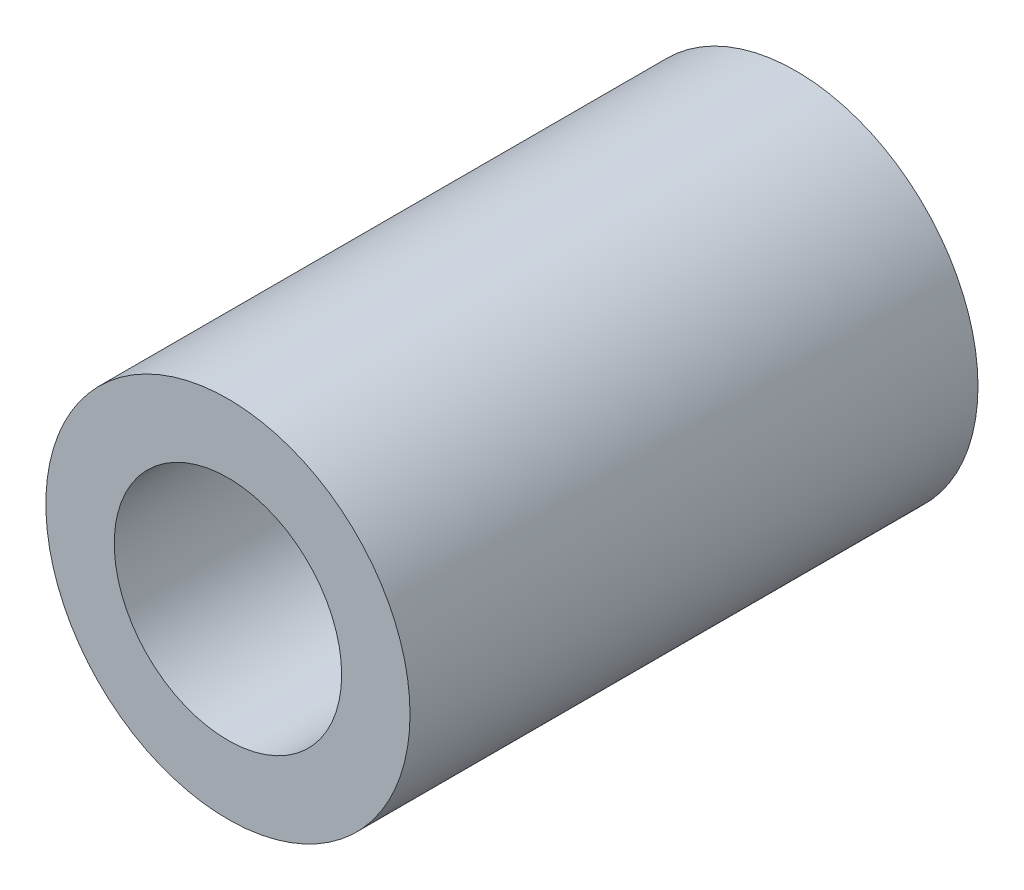
ISO-10303-21;
HEADER;
FILE_DESCRIPTION(('STEP AP214'),'2;1');
FILE_NAME('part.step','',(''),(''),'','','');
FILE_SCHEMA(('AUTOMOTIVE_DESIGN { 1 0 10303 214 1 1 1 1 }'));
ENDSEC;
DATA;
#1=APPLICATION_CONTEXT('core data for automotive mechanical design processes');
#2=APPLICATION_PROTOCOL_DEFINITION('international standard','automotive_design',2000,#1);
#3=PRODUCT_CONTEXT('',#1,'mechanical');
#4=PRODUCT('Part','Part','',(#3));
#5=PRODUCT_RELATED_PRODUCT_CATEGORY('part','',(#4));
#6=PRODUCT_DEFINITION_FORMATION('','',#4);
#7=PRODUCT_DEFINITION_CONTEXT('part definition',#1,'design');
#8=PRODUCT_DEFINITION('design','',#6,#7);
#9=PRODUCT_DEFINITION_SHAPE('','',#8);
#10=(LENGTH_UNIT() NAMED_UNIT(*) SI_UNIT(.MILLI.,.METRE.));
#11=(NAMED_UNIT(*) PLANE_ANGLE_UNIT() SI_UNIT($,.RADIAN.));
#12=(NAMED_UNIT(*) SI_UNIT($,.STERADIAN.) SOLID_ANGLE_UNIT());
#13=UNCERTAINTY_MEASURE_WITH_UNIT(LENGTH_MEASURE(1.E-05),#10,'distance_accuracy_value','');
#14=(GEOMETRIC_REPRESENTATION_CONTEXT(3) GLOBAL_UNCERTAINTY_ASSIGNED_CONTEXT((#13)) GLOBAL_UNIT_ASSIGNED_CONTEXT((#10,
#11,#12)) REPRESENTATION_CONTEXT('',''));
#15=CARTESIAN_POINT('',(0.,0.,0.));
#16=DIRECTION('',(0.,0.,1.));
#17=DIRECTION('',(1.,0.,0.));
#18=AXIS2_PLACEMENT_3D('',#15,#16,#17);
#19=CARTESIAN_POINT('',(0.,8.015,12.5));
#20=DIRECTION('',(0.,0.,-1.));
#21=DIRECTION('',(-1.,0.,0.));
#22=AXIS2_PLACEMENT_3D('',#19,#20,#21);
#23=PLANE('',#22);
#24=CARTESIAN_POINT('',(0.,0.,12.5));
#25=DIRECTION('',(0.,0.,1.));
#26=DIRECTION('',(1.,0.,0.));
#27=AXIS2_PLACEMENT_3D('',#24,#25,#26);
#28=CIRCLE('',#27,5.005);
#29=CARTESIAN_POINT('',(5.005,0.,12.5));
#30=VERTEX_POINT('',#29);
#31=EDGE_CURVE('E10',#30,#30,#28,.T.);
#32=ORIENTED_EDGE('',*,*,#31,.F.);
#33=EDGE_LOOP('',(#32));
#34=FACE_BOUND('',#33,.T.);
#35=CARTESIAN_POINT('',(0.,0.,12.5));
#36=DIRECTION('',(0.,0.,1.));
#37=DIRECTION('',(1.,0.,0.));
#38=AXIS2_PLACEMENT_3D('',#35,#36,#37);
#39=CIRCLE('',#38,8.015);
#40=CARTESIAN_POINT('',(8.015,0.,12.5));
#41=VERTEX_POINT('',#40);
#42=EDGE_CURVE('E51',#41,#41,#39,.T.);
#43=ORIENTED_EDGE('',*,*,#42,.T.);
#44=EDGE_LOOP('',(#43));
#45=FACE_BOUND('',#44,.T.);
#46=ADVANCED_FACE('F37',(#34,#45),#23,.F.);
#47=CARTESIAN_POINT('',(0.,0.,12.5));
#48=DIRECTION('',(0.,0.,1.));
#49=DIRECTION('',(1.,0.,0.));
#50=AXIS2_PLACEMENT_3D('',#47,#48,#49);
#51=CYLINDRICAL_SURFACE('',#50,5.005);
#52=CARTESIAN_POINT('',(0.,0.,-12.5));
#53=DIRECTION('',(0.,0.,1.));
#54=DIRECTION('',(1.,0.,0.));
#55=AXIS2_PLACEMENT_3D('',#52,#53,#54);
#56=CIRCLE('',#55,5.005);
#57=CARTESIAN_POINT('',(5.005,0.,-12.5));
#58=VERTEX_POINT('',#57);
#59=EDGE_CURVE('E43',#58,#58,#56,.T.);
#60=ORIENTED_EDGE('',*,*,#59,.F.);
#61=EDGE_LOOP('',(#60));
#62=FACE_BOUND('',#61,.T.);
#63=ORIENTED_EDGE('',*,*,#31,.T.);
#64=EDGE_LOOP('',(#63));
#65=FACE_BOUND('',#64,.T.);
#66=ADVANCED_FACE('F66',(#62,#65),#51,.F.);
#67=CARTESIAN_POINT('',(0.,8.015,-12.5));
#68=DIRECTION('',(0.,0.,1.));
#69=DIRECTION('',(1.,0.,0.));
#70=AXIS2_PLACEMENT_3D('',#67,#68,#69);
#71=PLANE('',#70);
#72=CARTESIAN_POINT('',(0.,0.,-12.5));
#73=DIRECTION('',(0.,0.,1.));
#74=DIRECTION('',(1.,0.,0.));
#75=AXIS2_PLACEMENT_3D('',#72,#73,#74);
#76=CIRCLE('',#75,8.015);
#77=CARTESIAN_POINT('',(8.015,0.,-12.5));
#78=VERTEX_POINT('',#77);
#79=EDGE_CURVE('E47',#78,#78,#76,.T.);
#80=ORIENTED_EDGE('',*,*,#79,.F.);
#81=EDGE_LOOP('',(#80));
#82=FACE_BOUND('',#81,.T.);
#83=ORIENTED_EDGE('',*,*,#59,.T.);
#84=EDGE_LOOP('',(#83));
#85=FACE_BOUND('',#84,.T.);
#86=ADVANCED_FACE('F61',(#82,#85),#71,.F.);
#87=CARTESIAN_POINT('',(0.,0.,12.5));
#88=DIRECTION('',(0.,0.,1.));
#89=DIRECTION('',(1.,0.,0.));
#90=AXIS2_PLACEMENT_3D('',#87,#88,#89);
#91=CYLINDRICAL_SURFACE('',#90,8.015);
#92=ORIENTED_EDGE('',*,*,#42,.F.);
#93=EDGE_LOOP('',(#92));
#94=FACE_BOUND('',#93,.T.);
#95=ORIENTED_EDGE('',*,*,#79,.T.);
#96=EDGE_LOOP('',(#95));
#97=FACE_BOUND('',#96,.T.);
#98=ADVANCED_FACE('F58',(#94,#97),#91,.T.);
#99=CLOSED_SHELL('',(#46,#66,#86,#98));
#100=MANIFOLD_SOLID_BREP('B2',#99);
#101=ADVANCED_BREP_SHAPE_REPRESENTATION('',(#18,#100),#14);
#102=SHAPE_DEFINITION_REPRESENTATION(#9,#101);
ENDSEC;
END-ISO-10303-21;
